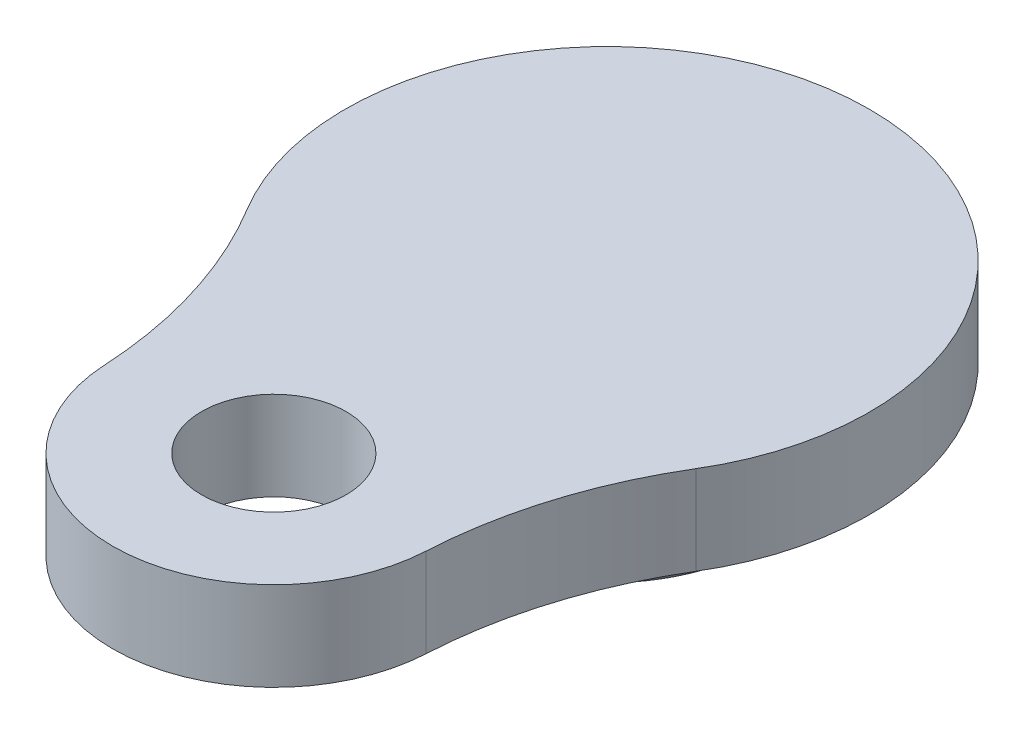
ISO-10303-21;
HEADER;
FILE_DESCRIPTION(('STEP AP214'),'2;1');
FILE_NAME('part.step','',(''),(''),'','','');
FILE_SCHEMA(('AUTOMOTIVE_DESIGN { 1 0 10303 214 1 1 1 1 }'));
ENDSEC;
DATA;
#1=APPLICATION_CONTEXT('core data for automotive mechanical design processes');
#2=APPLICATION_PROTOCOL_DEFINITION('international standard','automotive_design',2000,#1);
#3=PRODUCT_CONTEXT('',#1,'mechanical');
#4=PRODUCT('Part','Part','',(#3));
#5=PRODUCT_RELATED_PRODUCT_CATEGORY('part','',(#4));
#6=PRODUCT_DEFINITION_FORMATION('','',#4);
#7=PRODUCT_DEFINITION_CONTEXT('part definition',#1,'design');
#8=PRODUCT_DEFINITION('design','',#6,#7);
#9=PRODUCT_DEFINITION_SHAPE('','',#8);
#10=(LENGTH_UNIT() NAMED_UNIT(*) SI_UNIT(.MILLI.,.METRE.));
#11=(NAMED_UNIT(*) PLANE_ANGLE_UNIT() SI_UNIT($,.RADIAN.));
#12=(NAMED_UNIT(*) SI_UNIT($,.STERADIAN.) SOLID_ANGLE_UNIT());
#13=UNCERTAINTY_MEASURE_WITH_UNIT(LENGTH_MEASURE(1.E-05),#10,'distance_accuracy_value','');
#14=(GEOMETRIC_REPRESENTATION_CONTEXT(3) GLOBAL_UNCERTAINTY_ASSIGNED_CONTEXT((#13)) GLOBAL_UNIT_ASSIGNED_CONTEXT((#10,
#11,#12)) REPRESENTATION_CONTEXT('',''));
#15=CARTESIAN_POINT('',(0.,0.,0.));
#16=DIRECTION('',(0.,0.,1.));
#17=DIRECTION('',(1.,0.,0.));
#18=AXIS2_PLACEMENT_3D('',#15,#16,#17);
#19=CARTESIAN_POINT('',(13.6055393742744,2.,8.22795833333333));
#20=DIRECTION('',(0.,-1.,0.));
#21=DIRECTION('',(0.,0.,-1.));
#22=AXIS2_PLACEMENT_3D('',#19,#20,#21);
#23=CYLINDRICAL_SURFACE('',#22,10.);
#24=CARTESIAN_POINT('',(13.6055393742744,0.,8.22795833333333));
#25=DIRECTION('',(0.,1.,0.));
#26=DIRECTION('',(0.,0.,1.));
#27=AXIS2_PLACEMENT_3D('',#24,#25,#26);
#28=CIRCLE('',#27,10.);
#29=CARTESIAN_POINT('',(5.04859637158609,0.,3.05314177148847));
#30=VERTEX_POINT('',#29);
#31=CARTESIAN_POINT('',(3.61982240232988,0.,7.69367698776758));
#32=VERTEX_POINT('',#31);
#33=EDGE_CURVE('E116',#30,#32,#28,.T.);
#34=ORIENTED_EDGE('',*,*,#33,.F.);
#35=DIRECTION('',(0.,-1.,0.));
#36=VECTOR('',#35,1.);
#37=CARTESIAN_POINT('',(5.04859637158609,2.,3.05314177148847));
#38=LINE('',#37,#36);
#39=CARTESIAN_POINT('',(5.04859637158609,2.,3.05314177148847));
#40=VERTEX_POINT('',#39);
#41=EDGE_CURVE('E85',#40,#30,#38,.T.);
#42=ORIENTED_EDGE('',*,*,#41,.F.);
#43=CARTESIAN_POINT('',(13.6055393742744,2.,8.22795833333333));
#44=DIRECTION('',(0.,1.,0.));
#45=DIRECTION('',(0.,0.,1.));
#46=AXIS2_PLACEMENT_3D('',#43,#44,#45);
#47=CIRCLE('',#46,10.);
#48=CARTESIAN_POINT('',(3.61982240232988,2.,7.69367698776758));
#49=VERTEX_POINT('',#48);
#50=EDGE_CURVE('E94',#40,#49,#47,.T.);
#51=ORIENTED_EDGE('',*,*,#50,.T.);
#52=DIRECTION('',(0.,-1.,0.));
#53=VECTOR('',#52,1.);
#54=CARTESIAN_POINT('',(3.61982240232988,2.,7.69367698776758));
#55=LINE('',#54,#53);
#56=EDGE_CURVE('E81',#49,#32,#55,.T.);
#57=ORIENTED_EDGE('',*,*,#56,.T.);
#58=EDGE_LOOP('',(#34,#42,#51,#57));
#59=FACE_BOUND('',#58,.T.);
#60=ADVANCED_FACE('F39',(#59),#23,.F.);
#61=CARTESIAN_POINT('',(0.,2.,0.));
#62=DIRECTION('',(0.,-1.,0.));
#63=DIRECTION('',(0.,0.,-1.));
#64=AXIS2_PLACEMENT_3D('',#61,#62,#63);
#65=CYLINDRICAL_SURFACE('',#64,5.9);
#66=CARTESIAN_POINT('',(0.,0.,0.));
#67=DIRECTION('',(0.,1.,0.));
#68=DIRECTION('',(0.,0.,1.));
#69=AXIS2_PLACEMENT_3D('',#66,#67,#68);
#70=CIRCLE('',#69,5.9);
#71=CARTESIAN_POINT('',(-5.04859637158609,0.,3.05314177148847));
#72=VERTEX_POINT('',#71);
#73=EDGE_CURVE('E101',#30,#72,#70,.T.);
#74=ORIENTED_EDGE('',*,*,#73,.T.);
#75=DIRECTION('',(0.,-1.,0.));
#76=VECTOR('',#75,1.);
#77=CARTESIAN_POINT('',(-5.04859637158609,2.,3.05314177148847));
#78=LINE('',#77,#76);
#79=CARTESIAN_POINT('',(-5.04859637158609,2.,3.05314177148847));
#80=VERTEX_POINT('',#79);
#81=EDGE_CURVE('E98',#80,#72,#78,.T.);
#82=ORIENTED_EDGE('',*,*,#81,.F.);
#83=CARTESIAN_POINT('',(0.,2.,0.));
#84=DIRECTION('',(0.,1.,0.));
#85=DIRECTION('',(0.,0.,1.));
#86=AXIS2_PLACEMENT_3D('',#83,#84,#85);
#87=CIRCLE('',#86,5.9);
#88=EDGE_CURVE('E88',#40,#80,#87,.T.);
#89=ORIENTED_EDGE('',*,*,#88,.F.);
#90=ORIENTED_EDGE('',*,*,#41,.T.);
#91=EDGE_LOOP('',(#74,#82,#89,#90));
#92=FACE_BOUND('',#91,.T.);
#93=ADVANCED_FACE('F99',(#92),#65,.T.);
#94=CARTESIAN_POINT('',(-13.6055393742744,2.,8.22795833333333));
#95=DIRECTION('',(0.,-1.,0.));
#96=DIRECTION('',(0.,0.,-1.));
#97=AXIS2_PLACEMENT_3D('',#94,#95,#96);
#98=CYLINDRICAL_SURFACE('',#97,10.);
#99=CARTESIAN_POINT('',(-13.6055393742744,0.,8.22795833333333));
#100=DIRECTION('',(0.,1.,0.));
#101=DIRECTION('',(0.,0.,1.));
#102=AXIS2_PLACEMENT_3D('',#99,#100,#101);
#103=CIRCLE('',#102,10.);
#104=CARTESIAN_POINT('',(-3.61982240232988,0.,7.69367698776758));
#105=VERTEX_POINT('',#104);
#106=EDGE_CURVE('E74',#72,#105,#103,.F.);
#107=ORIENTED_EDGE('',*,*,#106,.T.);
#108=DIRECTION('',(0.,-1.,0.));
#109=VECTOR('',#108,1.);
#110=CARTESIAN_POINT('',(-3.61982240232988,2.,7.69367698776758));
#111=LINE('',#110,#109);
#112=CARTESIAN_POINT('',(-3.61982240232988,2.,7.69367698776758));
#113=VERTEX_POINT('',#112);
#114=EDGE_CURVE('E103',#113,#105,#111,.T.);
#115=ORIENTED_EDGE('',*,*,#114,.F.);
#116=CARTESIAN_POINT('',(-13.6055393742744,2.,8.22795833333333));
#117=DIRECTION('',(0.,1.,0.));
#118=DIRECTION('',(0.,0.,1.));
#119=AXIS2_PLACEMENT_3D('',#116,#117,#118);
#120=CIRCLE('',#119,10.);
#121=EDGE_CURVE('E93',#80,#113,#120,.F.);
#122=ORIENTED_EDGE('',*,*,#121,.F.);
#123=ORIENTED_EDGE('',*,*,#81,.T.);
#124=EDGE_LOOP('',(#107,#115,#122,#123));
#125=FACE_BOUND('',#124,.T.);
#126=ADVANCED_FACE('F105',(#125),#98,.F.);
#127=CARTESIAN_POINT('',(0.,2.,7.5));
#128=DIRECTION('',(0.,-1.,0.));
#129=DIRECTION('',(0.,0.,-1.));
#130=AXIS2_PLACEMENT_3D('',#127,#128,#129);
#131=CYLINDRICAL_SURFACE('',#130,3.625);
#132=CARTESIAN_POINT('',(0.,0.,7.5));
#133=DIRECTION('',(0.,1.,0.));
#134=DIRECTION('',(0.,0.,1.));
#135=AXIS2_PLACEMENT_3D('',#132,#133,#134);
#136=CIRCLE('',#135,3.625);
#137=EDGE_CURVE('E125',#105,#32,#136,.T.);
#138=ORIENTED_EDGE('',*,*,#137,.T.);
#139=ORIENTED_EDGE('',*,*,#56,.F.);
#140=CARTESIAN_POINT('',(0.,2.,7.5));
#141=DIRECTION('',(0.,1.,0.));
#142=DIRECTION('',(0.,0.,1.));
#143=AXIS2_PLACEMENT_3D('',#140,#141,#142);
#144=CIRCLE('',#143,3.625);
#145=EDGE_CURVE('E57',#113,#49,#144,.T.);
#146=ORIENTED_EDGE('',*,*,#145,.F.);
#147=ORIENTED_EDGE('',*,*,#114,.T.);
#148=EDGE_LOOP('',(#138,#139,#146,#147));
#149=FACE_BOUND('',#148,.T.);
#150=ADVANCED_FACE('F161',(#149),#131,.T.);
#151=CARTESIAN_POINT('',(0.,2.,7.5));
#152=DIRECTION('',(0.,-1.,0.));
#153=DIRECTION('',(0.,0.,-1.));
#154=AXIS2_PLACEMENT_3D('',#151,#152,#153);
#155=CYLINDRICAL_SURFACE('',#154,1.625);
#156=CARTESIAN_POINT('',(0.,2.,7.5));
#157=DIRECTION('',(0.,1.,0.));
#158=DIRECTION('',(0.,0.,1.));
#159=AXIS2_PLACEMENT_3D('',#156,#157,#158);
#160=CIRCLE('',#159,1.625);
#161=CARTESIAN_POINT('',(0.,2.,9.125));
#162=VERTEX_POINT('',#161);
#163=EDGE_CURVE('E109',#162,#162,#160,.T.);
#164=ORIENTED_EDGE('',*,*,#163,.T.);
#165=EDGE_LOOP('',(#164));
#166=FACE_BOUND('',#165,.T.);
#167=CARTESIAN_POINT('',(0.,0.,7.5));
#168=DIRECTION('',(0.,1.,0.));
#169=DIRECTION('',(0.,0.,1.));
#170=AXIS2_PLACEMENT_3D('',#167,#168,#169);
#171=CIRCLE('',#170,1.625);
#172=CARTESIAN_POINT('',(0.,0.,9.125));
#173=VERTEX_POINT('',#172);
#174=EDGE_CURVE('E128',#173,#173,#171,.T.);
#175=ORIENTED_EDGE('',*,*,#174,.F.);
#176=EDGE_LOOP('',(#175));
#177=FACE_BOUND('',#176,.T.);
#178=ADVANCED_FACE('F164',(#166,#177),#155,.F.);
#179=CARTESIAN_POINT('',(0.,2.,0.));
#180=DIRECTION('',(0.,1.,0.));
#181=DIRECTION('',(0.,0.,1.));
#182=AXIS2_PLACEMENT_3D('',#179,#180,#181);
#183=PLANE('',#182);
#184=ORIENTED_EDGE('',*,*,#50,.F.);
#185=ORIENTED_EDGE('',*,*,#88,.T.);
#186=ORIENTED_EDGE('',*,*,#121,.T.);
#187=ORIENTED_EDGE('',*,*,#145,.T.);
#188=EDGE_LOOP('',(#184,#185,#186,#187));
#189=FACE_BOUND('',#188,.T.);
#190=ORIENTED_EDGE('',*,*,#163,.F.);
#191=EDGE_LOOP('',(#190));
#192=FACE_BOUND('',#191,.T.);
#193=ADVANCED_FACE('F90',(#189,#192),#183,.T.);
#194=CARTESIAN_POINT('',(0.,0.,0.));
#195=DIRECTION('',(0.,1.,0.));
#196=DIRECTION('',(0.,0.,1.));
#197=AXIS2_PLACEMENT_3D('',#194,#195,#196);
#198=PLANE('',#197);
#199=CARTESIAN_POINT('',(0.,0.,0.));
#200=DIRECTION('',(0.,1.,0.));
#201=DIRECTION('',(0.,0.,1.));
#202=AXIS2_PLACEMENT_3D('',#199,#200,#201);
#203=CIRCLE('',#202,3.9);
#204=CARTESIAN_POINT('',(0.,0.,3.9));
#205=VERTEX_POINT('',#204);
#206=EDGE_CURVE('E120',#205,#205,#203,.T.);
#207=ORIENTED_EDGE('',*,*,#206,.T.);
#208=EDGE_LOOP('',(#207));
#209=FACE_BOUND('',#208,.T.);
#210=ORIENTED_EDGE('',*,*,#33,.T.);
#211=ORIENTED_EDGE('',*,*,#137,.F.);
#212=ORIENTED_EDGE('',*,*,#106,.F.);
#213=ORIENTED_EDGE('',*,*,#73,.F.);
#214=EDGE_LOOP('',(#210,#211,#212,#213));
#215=FACE_BOUND('',#214,.T.);
#216=ORIENTED_EDGE('',*,*,#174,.T.);
#217=EDGE_LOOP('',(#216));
#218=FACE_BOUND('',#217,.T.);
#219=ADVANCED_FACE('F169',(#209,#215,#218),#198,.F.);
#220=CARTESIAN_POINT('',(0.,-2.,0.));
#221=DIRECTION('',(0.,1.,0.));
#222=DIRECTION('',(0.,0.,1.));
#223=AXIS2_PLACEMENT_3D('',#220,#221,#222);
#224=CYLINDRICAL_SURFACE('',#223,3.9);
#225=CARTESIAN_POINT('',(0.,-1.,0.));
#226=DIRECTION('',(0.,1.,0.));
#227=DIRECTION('',(0.,0.,1.));
#228=AXIS2_PLACEMENT_3D('',#225,#226,#227);
#229=CIRCLE('',#228,3.9);
#230=CARTESIAN_POINT('',(0.,-1.,3.9));
#231=VERTEX_POINT('',#230);
#232=EDGE_CURVE('E49',#231,#231,#229,.T.);
#233=ORIENTED_EDGE('',*,*,#232,.T.);
#234=EDGE_LOOP('',(#233));
#235=FACE_BOUND('',#234,.T.);
#236=ORIENTED_EDGE('',*,*,#206,.F.);
#237=EDGE_LOOP('',(#236));
#238=FACE_BOUND('',#237,.T.);
#239=ADVANCED_FACE('F141',(#235,#238),#224,.T.);
#240=CARTESIAN_POINT('',(0.,-2.,0.));
#241=DIRECTION('',(0.,1.,0.));
#242=DIRECTION('',(0.,0.,1.));
#243=AXIS2_PLACEMENT_3D('',#240,#241,#242);
#244=PLANE('',#243);
#245=CARTESIAN_POINT('',(0.,-2.,0.));
#246=DIRECTION('',(0.,1.,0.));
#247=DIRECTION('',(0.,0.,1.));
#248=AXIS2_PLACEMENT_3D('',#245,#246,#247);
#249=CIRCLE('',#248,2.9);
#250=CARTESIAN_POINT('',(0.,-2.,2.9));
#251=VERTEX_POINT('',#250);
#252=EDGE_CURVE('E11',#251,#251,#249,.F.);
#253=ORIENTED_EDGE('',*,*,#252,.T.);
#254=EDGE_LOOP('',(#253));
#255=FACE_BOUND('',#254,.T.);
#256=ADVANCED_FACE('F145',(#255),#244,.F.);
#257=CARTESIAN_POINT('',(0.,-1.,0.));
#258=DIRECTION('',(0.,1.,0.));
#259=DIRECTION('',(0.,0.,1.));
#260=AXIS2_PLACEMENT_3D('',#257,#258,#259);
#261=TOROIDAL_SURFACE('',#260,2.9,1.);
#262=ORIENTED_EDGE('',*,*,#252,.F.);
#263=EDGE_LOOP('',(#262));
#264=FACE_BOUND('',#263,.T.);
#265=ORIENTED_EDGE('',*,*,#232,.F.);
#266=EDGE_LOOP('',(#265));
#267=FACE_BOUND('',#266,.T.);
#268=ADVANCED_FACE('F41',(#264,#267),#261,.T.);
#269=CLOSED_SHELL('',(#60,#93,#126,#150,#178,#193,#219,#239,#256,#268));
#270=MANIFOLD_SOLID_BREP('B2',#269);
#271=ADVANCED_BREP_SHAPE_REPRESENTATION('',(#18,#270),#14);
#272=SHAPE_DEFINITION_REPRESENTATION(#9,#271);
ENDSEC;
END-ISO-10303-21;
